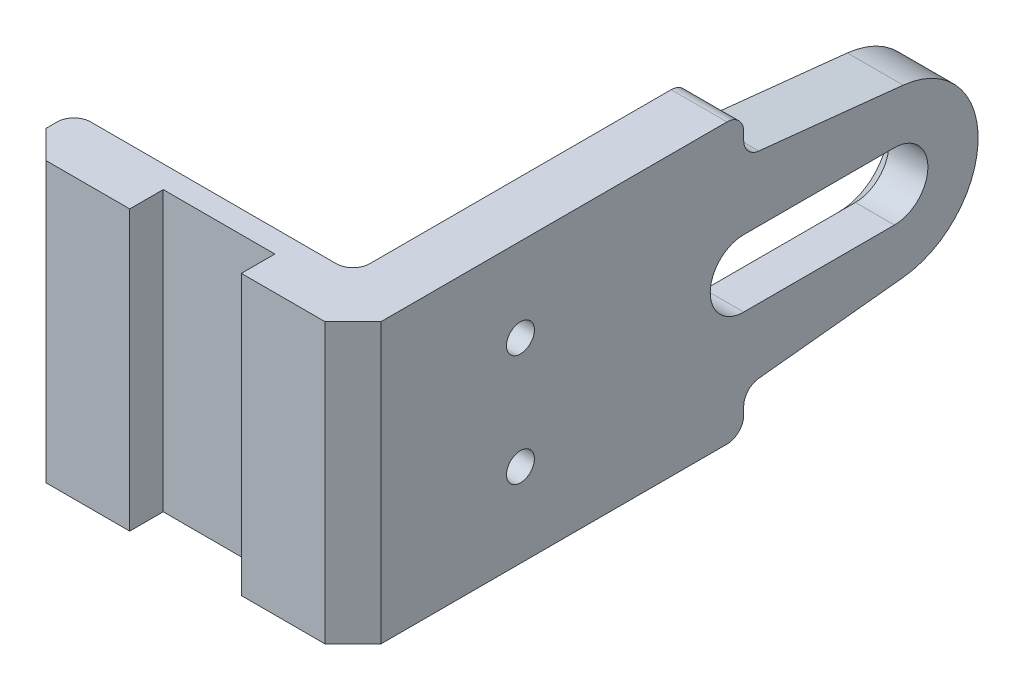
ISO-10303-21;
HEADER;
FILE_DESCRIPTION(('STEP AP214'),'2;1');
FILE_NAME('part.step','',(''),(''),'','','');
FILE_SCHEMA(('AUTOMOTIVE_DESIGN { 1 0 10303 214 1 1 1 1 }'));
ENDSEC;
DATA;
#1=APPLICATION_CONTEXT('core data for automotive mechanical design processes');
#2=APPLICATION_PROTOCOL_DEFINITION('international standard','automotive_design',2000,#1);
#3=PRODUCT_CONTEXT('',#1,'mechanical');
#4=PRODUCT('Part','Part','',(#3));
#5=PRODUCT_RELATED_PRODUCT_CATEGORY('part','',(#4));
#6=PRODUCT_DEFINITION_FORMATION('','',#4);
#7=PRODUCT_DEFINITION_CONTEXT('part definition',#1,'design');
#8=PRODUCT_DEFINITION('design','',#6,#7);
#9=PRODUCT_DEFINITION_SHAPE('','',#8);
#10=(LENGTH_UNIT() NAMED_UNIT(*) SI_UNIT(.MILLI.,.METRE.));
#11=(NAMED_UNIT(*) PLANE_ANGLE_UNIT() SI_UNIT($,.RADIAN.));
#12=(NAMED_UNIT(*) SI_UNIT($,.STERADIAN.) SOLID_ANGLE_UNIT());
#13=UNCERTAINTY_MEASURE_WITH_UNIT(LENGTH_MEASURE(1.E-05),#10,'distance_accuracy_value','');
#14=(GEOMETRIC_REPRESENTATION_CONTEXT(3) GLOBAL_UNCERTAINTY_ASSIGNED_CONTEXT((#13)) GLOBAL_UNIT_ASSIGNED_CONTEXT((#10,
#11,#12)) REPRESENTATION_CONTEXT('',''));
#15=CARTESIAN_POINT('',(0.,0.,0.));
#16=DIRECTION('',(0.,0.,1.));
#17=DIRECTION('',(1.,0.,0.));
#18=AXIS2_PLACEMENT_3D('',#15,#16,#17);
#19=CARTESIAN_POINT('',(0.,25.,0.));
#20=DIRECTION('',(0.,0.,1.));
#21=DIRECTION('',(1.,0.,0.));
#22=AXIS2_PLACEMENT_3D('',#19,#20,#21);
#23=PLANE('',#22);
#24=DIRECTION('',(-1.,0.,0.));
#25=VECTOR('',#24,1.);
#26=CARTESIAN_POINT('',(0.,0.,0.));
#27=LINE('',#26,#25);
#28=CARTESIAN_POINT('',(-2.50000000000002,0.,0.));
#29=VERTEX_POINT('',#28);
#30=CARTESIAN_POINT('',(-10.,0.,0.));
#31=VERTEX_POINT('',#30);
#32=EDGE_CURVE('E247',#29,#31,#27,.T.);
#33=ORIENTED_EDGE('',*,*,#32,.F.);
#34=DIRECTION('',(0.,1.,0.));
#35=VECTOR('',#34,1.);
#36=CARTESIAN_POINT('',(-2.50000000000002,25.,0.));
#37=LINE('',#36,#35);
#38=CARTESIAN_POINT('',(-2.50000000000002,25.,0.));
#39=VERTEX_POINT('',#38);
#40=EDGE_CURVE('E407',#29,#39,#37,.T.);
#41=ORIENTED_EDGE('',*,*,#40,.T.);
#42=DIRECTION('',(-1.,0.,0.));
#43=VECTOR('',#42,1.);
#44=CARTESIAN_POINT('',(0.,25.,0.));
#45=LINE('',#44,#43);
#46=CARTESIAN_POINT('',(-10.,25.,0.));
#47=VERTEX_POINT('',#46);
#48=EDGE_CURVE('E330',#39,#47,#45,.T.);
#49=ORIENTED_EDGE('',*,*,#48,.T.);
#50=DIRECTION('',(0.,1.,0.));
#51=VECTOR('',#50,1.);
#52=CARTESIAN_POINT('',(-10.,0.,0.));
#53=LINE('',#52,#51);
#54=EDGE_CURVE('E242',#31,#47,#53,.T.);
#55=ORIENTED_EDGE('',*,*,#54,.F.);
#56=EDGE_LOOP('',(#33,#41,#49,#55));
#57=FACE_BOUND('',#56,.T.);
#58=ADVANCED_FACE('F35',(#57),#23,.T.);
#59=CARTESIAN_POINT('',(0.,25.,0.));
#60=DIRECTION('',(0.,-1.,0.));
#61=DIRECTION('',(0.,0.,-1.));
#62=AXIS2_PLACEMENT_3D('',#59,#60,#61);
#63=PLANE('',#62);
#64=DIRECTION('',(-1.,0.,0.));
#65=VECTOR('',#64,1.);
#66=CARTESIAN_POINT('',(-5.,25.,-5.));
#67=LINE('',#66,#65);
#68=CARTESIAN_POINT('',(-6.5,25.,-5.));
#69=VERTEX_POINT('',#68);
#70=CARTESIAN_POINT('',(-28.5,25.,-5.));
#71=VERTEX_POINT('',#70);
#72=EDGE_CURVE('E336',#69,#71,#67,.T.);
#73=ORIENTED_EDGE('',*,*,#72,.T.);
#74=CARTESIAN_POINT('',(-28.5,25.,-3.5));
#75=DIRECTION('',(0.,-1.,0.));
#76=DIRECTION('',(0.,0.,-1.));
#77=AXIS2_PLACEMENT_3D('',#74,#75,#76);
#78=CIRCLE('',#77,1.5);
#79=CARTESIAN_POINT('',(-30.,25.,-3.5));
#80=VERTEX_POINT('',#79);
#81=EDGE_CURVE('E428',#71,#80,#78,.F.);
#82=ORIENTED_EDGE('',*,*,#81,.T.);
#83=DIRECTION('',(0.,0.,-1.));
#84=VECTOR('',#83,1.);
#85=CARTESIAN_POINT('',(-30.,25.,0.));
#86=LINE('',#85,#84);
#87=CARTESIAN_POINT('',(-30.,25.,-2.50000000000001));
#88=VERTEX_POINT('',#87);
#89=EDGE_CURVE('E332',#88,#80,#86,.T.);
#90=ORIENTED_EDGE('',*,*,#89,.F.);
#91=DIRECTION('',(-0.707106781186546,0.,-0.707106781186549));
#92=VECTOR('',#91,1.);
#93=CARTESIAN_POINT('',(-27.5,25.,0.));
#94=LINE('',#93,#92);
#95=CARTESIAN_POINT('',(-27.5,25.,0.));
#96=VERTEX_POINT('',#95);
#97=EDGE_CURVE('E409',#88,#96,#94,.F.);
#98=ORIENTED_EDGE('',*,*,#97,.T.);
#99=CARTESIAN_POINT('',(-20.,25.,0.));
#100=VERTEX_POINT('',#99);
#101=EDGE_CURVE('E333',#100,#96,#45,.T.);
#102=ORIENTED_EDGE('',*,*,#101,.F.);
#103=DIRECTION('',(0.,0.,1.));
#104=VECTOR('',#103,1.);
#105=CARTESIAN_POINT('',(-20.,25.,-3.));
#106=LINE('',#105,#104);
#107=CARTESIAN_POINT('',(-20.,25.,-3.));
#108=VERTEX_POINT('',#107);
#109=EDGE_CURVE('E232',#108,#100,#106,.T.);
#110=ORIENTED_EDGE('',*,*,#109,.F.);
#111=DIRECTION('',(1.,0.,0.));
#112=VECTOR('',#111,1.);
#113=CARTESIAN_POINT('',(-20.,25.,-3.));
#114=LINE('',#113,#112);
#115=CARTESIAN_POINT('',(-10.,25.,-3.));
#116=VERTEX_POINT('',#115);
#117=EDGE_CURVE('E252',#108,#116,#114,.T.);
#118=ORIENTED_EDGE('',*,*,#117,.T.);
#119=DIRECTION('',(0.,0.,1.));
#120=VECTOR('',#119,1.);
#121=CARTESIAN_POINT('',(-10.,25.,-3.));
#122=LINE('',#121,#120);
#123=EDGE_CURVE('E240',#116,#47,#122,.T.);
#124=ORIENTED_EDGE('',*,*,#123,.T.);
#125=ORIENTED_EDGE('',*,*,#48,.F.);
#126=DIRECTION('',(0.707106781186549,0.,-0.707106781186546));
#127=VECTOR('',#126,1.);
#128=CARTESIAN_POINT('',(0.,25.,-2.50000000000001));
#129=LINE('',#128,#127);
#130=CARTESIAN_POINT('',(0.,25.,-2.50000000000001));
#131=VERTEX_POINT('',#130);
#132=EDGE_CURVE('E411',#39,#131,#129,.T.);
#133=ORIENTED_EDGE('',*,*,#132,.T.);
#134=DIRECTION('',(0.,0.,-1.));
#135=VECTOR('',#134,1.);
#136=CARTESIAN_POINT('',(0.,25.,0.));
#137=LINE('',#136,#135);
#138=CARTESIAN_POINT('',(0.,25.,-33.5));
#139=VERTEX_POINT('',#138);
#140=EDGE_CURVE('E341',#131,#139,#137,.T.);
#141=ORIENTED_EDGE('',*,*,#140,.T.);
#142=DIRECTION('',(-1.,0.,0.));
#143=VECTOR('',#142,1.);
#144=CARTESIAN_POINT('',(0.,25.,-33.5));
#145=LINE('',#144,#143);
#146=CARTESIAN_POINT('',(-5.,25.,-33.5));
#147=VERTEX_POINT('',#146);
#148=EDGE_CURVE('E389',#139,#147,#145,.T.);
#149=ORIENTED_EDGE('',*,*,#148,.T.);
#150=DIRECTION('',(0.,0.,-1.));
#151=VECTOR('',#150,1.);
#152=CARTESIAN_POINT('',(-5.,25.,-5.));
#153=LINE('',#152,#151);
#154=CARTESIAN_POINT('',(-5.,25.,-6.5));
#155=VERTEX_POINT('',#154);
#156=EDGE_CURVE('E339',#155,#147,#153,.T.);
#157=ORIENTED_EDGE('',*,*,#156,.F.);
#158=CARTESIAN_POINT('',(-6.5,25.,-6.5));
#159=DIRECTION('',(0.,-1.,0.));
#160=DIRECTION('',(0.,0.,-1.));
#161=AXIS2_PLACEMENT_3D('',#158,#159,#160);
#162=CIRCLE('',#161,1.5);
#163=EDGE_CURVE('E434',#155,#69,#162,.T.);
#164=ORIENTED_EDGE('',*,*,#163,.T.);
#165=EDGE_LOOP('',(#73,#82,#90,#98,#102,#110,#118,#124,#125,#133,#141,#149,#157,#164));
#166=FACE_BOUND('',#165,.T.);
#167=ADVANCED_FACE('F502',(#166),#63,.F.);
#168=CARTESIAN_POINT('',(0.,0.,0.));
#169=DIRECTION('',(0.,-1.,0.));
#170=DIRECTION('',(0.,0.,-1.));
#171=AXIS2_PLACEMENT_3D('',#168,#169,#170);
#172=PLANE('',#171);
#173=DIRECTION('',(0.,0.,-1.));
#174=VECTOR('',#173,1.);
#175=CARTESIAN_POINT('',(-30.,0.,0.));
#176=LINE('',#175,#174);
#177=CARTESIAN_POINT('',(-30.,0.,-2.50000000000001));
#178=VERTEX_POINT('',#177);
#179=CARTESIAN_POINT('',(-30.,0.,-3.5));
#180=VERTEX_POINT('',#179);
#181=EDGE_CURVE('E345',#178,#180,#176,.T.);
#182=ORIENTED_EDGE('',*,*,#181,.T.);
#183=CARTESIAN_POINT('',(-28.5,0.,-3.5));
#184=DIRECTION('',(0.,-1.,0.));
#185=DIRECTION('',(0.,0.,-1.));
#186=AXIS2_PLACEMENT_3D('',#183,#184,#185);
#187=CIRCLE('',#186,1.5);
#188=CARTESIAN_POINT('',(-28.5,0.,-5.));
#189=VERTEX_POINT('',#188);
#190=EDGE_CURVE('E421',#180,#189,#187,.T.);
#191=ORIENTED_EDGE('',*,*,#190,.T.);
#192=DIRECTION('',(-1.,0.,0.));
#193=VECTOR('',#192,1.);
#194=CARTESIAN_POINT('',(-5.,0.,-5.));
#195=LINE('',#194,#193);
#196=CARTESIAN_POINT('',(-6.5,0.,-5.));
#197=VERTEX_POINT('',#196);
#198=EDGE_CURVE('E347',#197,#189,#195,.T.);
#199=ORIENTED_EDGE('',*,*,#198,.F.);
#200=CARTESIAN_POINT('',(-6.5,0.,-6.5));
#201=DIRECTION('',(0.,-1.,0.));
#202=DIRECTION('',(0.,0.,-1.));
#203=AXIS2_PLACEMENT_3D('',#200,#201,#202);
#204=CIRCLE('',#203,1.5);
#205=CARTESIAN_POINT('',(-5.,0.,-6.5));
#206=VERTEX_POINT('',#205);
#207=EDGE_CURVE('E432',#197,#206,#204,.F.);
#208=ORIENTED_EDGE('',*,*,#207,.T.);
#209=DIRECTION('',(0.,0.,-1.));
#210=VECTOR('',#209,1.);
#211=CARTESIAN_POINT('',(-5.,0.,-5.));
#212=LINE('',#211,#210);
#213=CARTESIAN_POINT('',(-5.,0.,-33.5));
#214=VERTEX_POINT('',#213);
#215=EDGE_CURVE('E350',#206,#214,#212,.T.);
#216=ORIENTED_EDGE('',*,*,#215,.T.);
#217=DIRECTION('',(-1.,0.,0.));
#218=VECTOR('',#217,1.);
#219=CARTESIAN_POINT('',(0.,0.,-33.5));
#220=LINE('',#219,#218);
#221=CARTESIAN_POINT('',(0.,0.,-33.5));
#222=VERTEX_POINT('',#221);
#223=EDGE_CURVE('E381',#214,#222,#220,.F.);
#224=ORIENTED_EDGE('',*,*,#223,.T.);
#225=DIRECTION('',(0.,0.,-1.));
#226=VECTOR('',#225,1.);
#227=CARTESIAN_POINT('',(0.,0.,0.));
#228=LINE('',#227,#226);
#229=CARTESIAN_POINT('',(0.,0.,-2.50000000000001));
#230=VERTEX_POINT('',#229);
#231=EDGE_CURVE('E352',#230,#222,#228,.T.);
#232=ORIENTED_EDGE('',*,*,#231,.F.);
#233=DIRECTION('',(-0.707106781186549,0.,0.707106781186546));
#234=VECTOR('',#233,1.);
#235=CARTESIAN_POINT('',(-1.25,0.,-1.25000000000001));
#236=LINE('',#235,#234);
#237=EDGE_CURVE('E405',#230,#29,#236,.T.);
#238=ORIENTED_EDGE('',*,*,#237,.T.);
#239=ORIENTED_EDGE('',*,*,#32,.T.);
#240=DIRECTION('',(0.,0.,1.));
#241=VECTOR('',#240,1.);
#242=CARTESIAN_POINT('',(-10.,0.,-3.));
#243=LINE('',#242,#241);
#244=CARTESIAN_POINT('',(-10.,0.,-3.));
#245=VERTEX_POINT('',#244);
#246=EDGE_CURVE('E231',#245,#31,#243,.T.);
#247=ORIENTED_EDGE('',*,*,#246,.F.);
#248=DIRECTION('',(1.,0.,0.));
#249=VECTOR('',#248,1.);
#250=CARTESIAN_POINT('',(-20.,0.,-3.));
#251=LINE('',#250,#249);
#252=CARTESIAN_POINT('',(-20.,0.,-3.));
#253=VERTEX_POINT('',#252);
#254=EDGE_CURVE('E220',#253,#245,#251,.T.);
#255=ORIENTED_EDGE('',*,*,#254,.F.);
#256=DIRECTION('',(0.,0.,1.));
#257=VECTOR('',#256,1.);
#258=CARTESIAN_POINT('',(-20.,0.,-3.));
#259=LINE('',#258,#257);
#260=CARTESIAN_POINT('',(-20.,0.,0.));
#261=VERTEX_POINT('',#260);
#262=EDGE_CURVE('E248',#253,#261,#259,.T.);
#263=ORIENTED_EDGE('',*,*,#262,.T.);
#264=CARTESIAN_POINT('',(-27.5,0.,0.));
#265=VERTEX_POINT('',#264);
#266=EDGE_CURVE('E329',#261,#265,#27,.T.);
#267=ORIENTED_EDGE('',*,*,#266,.T.);
#268=DIRECTION('',(0.707106781186546,0.,0.707106781186549));
#269=VECTOR('',#268,1.);
#270=CARTESIAN_POINT('',(-13.7500000000001,0.,13.75));
#271=LINE('',#270,#269);
#272=EDGE_CURVE('E403',#265,#178,#271,.F.);
#273=ORIENTED_EDGE('',*,*,#272,.T.);
#274=EDGE_LOOP('',(#182,#191,#199,#208,#216,#224,#232,#238,#239,#247,#255,#263,#267,#273));
#275=FACE_BOUND('',#274,.T.);
#276=ADVANCED_FACE('F245',(#275),#172,.T.);
#277=CARTESIAN_POINT('',(0.,25.,0.));
#278=DIRECTION('',(-1.,0.,0.));
#279=DIRECTION('',(0.,0.,1.));
#280=AXIS2_PLACEMENT_3D('',#277,#278,#279);
#281=PLANE('',#280);
#282=CARTESIAN_POINT('',(0.,17.5,-15.));
#283=DIRECTION('',(1.,0.,0.));
#284=DIRECTION('',(0.,0.,-1.));
#285=AXIS2_PLACEMENT_3D('',#282,#283,#284);
#286=CIRCLE('',#285,1.25);
#287=CARTESIAN_POINT('',(0.,17.5,-16.25));
#288=VERTEX_POINT('',#287);
#289=EDGE_CURVE('E279',#288,#288,#286,.T.);
#290=ORIENTED_EDGE('',*,*,#289,.F.);
#291=EDGE_LOOP('',(#290));
#292=FACE_BOUND('',#291,.T.);
#293=CARTESIAN_POINT('',(0.,7.5,-15.));
#294=DIRECTION('',(1.,0.,0.));
#295=DIRECTION('',(0.,0.,-1.));
#296=AXIS2_PLACEMENT_3D('',#293,#294,#295);
#297=CIRCLE('',#296,1.25);
#298=CARTESIAN_POINT('',(0.,7.5,-16.25));
#299=VERTEX_POINT('',#298);
#300=EDGE_CURVE('E269',#299,#299,#297,.T.);
#301=ORIENTED_EDGE('',*,*,#300,.F.);
#302=EDGE_LOOP('',(#301));
#303=FACE_BOUND('',#302,.T.);
#304=DIRECTION('',(0.,0.,-1.));
#305=VECTOR('',#304,1.);
#306=CARTESIAN_POINT('',(0.,9.5,-35.));
#307=LINE('',#306,#305);
#308=CARTESIAN_POINT('',(0.,9.5,-35.));
#309=VERTEX_POINT('',#308);
#310=CARTESIAN_POINT('',(0.,9.5,-48.5));
#311=VERTEX_POINT('',#310);
#312=EDGE_CURVE('E287',#309,#311,#307,.T.);
#313=ORIENTED_EDGE('',*,*,#312,.F.);
#314=CARTESIAN_POINT('',(0.,12.5,-35.));
#315=DIRECTION('',(1.,0.,0.));
#316=DIRECTION('',(0.,0.,-1.));
#317=AXIS2_PLACEMENT_3D('',#314,#315,#316);
#318=CIRCLE('',#317,3.);
#319=CARTESIAN_POINT('',(0.,15.5,-35.));
#320=VERTEX_POINT('',#319);
#321=EDGE_CURVE('E282',#320,#309,#318,.T.);
#322=ORIENTED_EDGE('',*,*,#321,.F.);
#323=DIRECTION('',(0.,0.,-1.));
#324=VECTOR('',#323,1.);
#325=CARTESIAN_POINT('',(0.,15.5,-35.));
#326=LINE('',#325,#324);
#327=CARTESIAN_POINT('',(0.,15.5,-48.5));
#328=VERTEX_POINT('',#327);
#329=EDGE_CURVE('E293',#320,#328,#326,.T.);
#330=ORIENTED_EDGE('',*,*,#329,.T.);
#331=CARTESIAN_POINT('',(0.,12.5,-48.5));
#332=DIRECTION('',(1.,0.,0.));
#333=DIRECTION('',(0.,0.,-1.));
#334=AXIS2_PLACEMENT_3D('',#331,#332,#333);
#335=CIRCLE('',#334,3.);
#336=EDGE_CURVE('E290',#311,#328,#335,.T.);
#337=ORIENTED_EDGE('',*,*,#336,.F.);
#338=EDGE_LOOP('',(#313,#322,#330,#337));
#339=FACE_BOUND('',#338,.T.);
#340=ORIENTED_EDGE('',*,*,#140,.F.);
#341=DIRECTION('',(0.,-1.,0.));
#342=VECTOR('',#341,1.);
#343=CARTESIAN_POINT('',(0.,0.,-2.50000000000001));
#344=LINE('',#343,#342);
#345=EDGE_CURVE('E400',#131,#230,#344,.T.);
#346=ORIENTED_EDGE('',*,*,#345,.T.);
#347=ORIENTED_EDGE('',*,*,#231,.T.);
#348=CARTESIAN_POINT('',(0.,1.5,-33.5));
#349=DIRECTION('',(-1.,0.,0.));
#350=DIRECTION('',(0.,0.,1.));
#351=AXIS2_PLACEMENT_3D('',#348,#349,#350);
#352=CIRCLE('',#351,1.5);
#353=CARTESIAN_POINT('',(0.,1.5,-35.));
#354=VERTEX_POINT('',#353);
#355=EDGE_CURVE('E387',#222,#354,#352,.F.);
#356=ORIENTED_EDGE('',*,*,#355,.T.);
#357=DIRECTION('',(0.,-1.,0.));
#358=VECTOR('',#357,1.);
#359=CARTESIAN_POINT('',(0.,0.,-35.));
#360=LINE('',#359,#358);
#361=CARTESIAN_POINT('',(0.,2.18917466074018,-35.));
#362=VERTEX_POINT('',#361);
#363=EDGE_CURVE('E306',#362,#354,#360,.T.);
#364=ORIENTED_EDGE('',*,*,#363,.F.);
#365=CARTESIAN_POINT('',(0.,2.18917466074018,-36.5));
#366=DIRECTION('',(-1.,0.,0.));
#367=DIRECTION('',(0.,0.,1.));
#368=AXIS2_PLACEMENT_3D('',#365,#366,#367);
#369=CIRCLE('',#368,1.5);
#370=CARTESIAN_POINT('',(0.,3.68095750379259,-36.3432073050985));
#371=VERTEX_POINT('',#370);
#372=EDGE_CURVE('E396',#362,#371,#369,.T.);
#373=ORIENTED_EDGE('',*,*,#372,.T.);
#374=DIRECTION('',(0.,0.104528463267658,-0.994521895368273));
#375=VECTOR('',#374,1.);
#376=CARTESIAN_POINT('',(0.,-0.137350213006646,-0.014436089101642));
#377=LINE('',#376,#375);
#378=CARTESIAN_POINT('',(0.,5.04108578473796,-49.2839634745074));
#379=VERTEX_POINT('',#378);
#380=EDGE_CURVE('E299',#371,#379,#377,.T.);
#381=ORIENTED_EDGE('',*,*,#380,.T.);
#382=CARTESIAN_POINT('',(0.,12.5,-48.5));
#383=DIRECTION('',(1.,0.,0.));
#384=DIRECTION('',(0.,0.,-1.));
#385=AXIS2_PLACEMENT_3D('',#382,#383,#384);
#386=CIRCLE('',#385,7.5);
#387=CARTESIAN_POINT('',(0.,19.9589142152621,-49.2839634745074));
#388=VERTEX_POINT('',#387);
#389=EDGE_CURVE('E320',#379,#388,#386,.T.);
#390=ORIENTED_EDGE('',*,*,#389,.T.);
#391=DIRECTION('',(0.,-0.10452846326765,-0.994521895368274));
#392=VECTOR('',#391,1.);
#393=CARTESIAN_POINT('',(0.,24.8641952221789,-2.61333222432352));
#394=LINE('',#393,#392);
#395=CARTESIAN_POINT('',(0.,21.3190424962073,-36.3432073050985));
#396=VERTEX_POINT('',#395);
#397=EDGE_CURVE('E318',#396,#388,#394,.T.);
#398=ORIENTED_EDGE('',*,*,#397,.F.);
#399=CARTESIAN_POINT('',(0.,22.8108253392597,-36.5));
#400=DIRECTION('',(-1.,0.,0.));
#401=DIRECTION('',(0.,0.,1.));
#402=AXIS2_PLACEMENT_3D('',#399,#400,#401);
#403=CIRCLE('',#402,1.5);
#404=CARTESIAN_POINT('',(0.,22.8108253392597,-35.));
#405=VERTEX_POINT('',#404);
#406=EDGE_CURVE('E392',#396,#405,#403,.T.);
#407=ORIENTED_EDGE('',*,*,#406,.T.);
#408=DIRECTION('',(0.,-1.,0.));
#409=VECTOR('',#408,1.);
#410=CARTESIAN_POINT('',(0.,0.,-35.));
#411=LINE('',#410,#409);
#412=CARTESIAN_POINT('',(0.,23.5,-35.));
#413=VERTEX_POINT('',#412);
#414=EDGE_CURVE('E315',#413,#405,#411,.T.);
#415=ORIENTED_EDGE('',*,*,#414,.F.);
#416=CARTESIAN_POINT('',(0.,23.5,-33.5));
#417=DIRECTION('',(-1.,0.,0.));
#418=DIRECTION('',(0.,0.,1.));
#419=AXIS2_PLACEMENT_3D('',#416,#417,#418);
#420=CIRCLE('',#419,1.5);
#421=EDGE_CURVE('E384',#413,#139,#420,.F.);
#422=ORIENTED_EDGE('',*,*,#421,.T.);
#423=EDGE_LOOP('',(#340,#346,#347,#356,#364,#373,#381,#390,#398,#407,#415,#422));
#424=FACE_BOUND('',#423,.T.);
#425=ADVANCED_FACE('F486',(#292,#303,#339,#424),#281,.F.);
#426=CARTESIAN_POINT('',(-5.,25.,-5.));
#427=DIRECTION('',(-1.,0.,0.));
#428=DIRECTION('',(0.,0.,1.));
#429=AXIS2_PLACEMENT_3D('',#426,#427,#428);
#430=PLANE('',#429);
#431=CARTESIAN_POINT('',(-5.,12.5,-35.));
#432=DIRECTION('',(-1.,0.,0.));
#433=DIRECTION('',(0.,0.,1.));
#434=AXIS2_PLACEMENT_3D('',#431,#432,#433);
#435=CIRCLE('',#434,4.5);
#436=CARTESIAN_POINT('',(-5.,17.,-35.));
#437=VERTEX_POINT('',#436);
#438=CARTESIAN_POINT('',(-5.,8.,-35.));
#439=VERTEX_POINT('',#438);
#440=EDGE_CURVE('E441',#437,#439,#435,.F.);
#441=ORIENTED_EDGE('',*,*,#440,.T.);
#442=DIRECTION('',(0.,0.,-1.));
#443=VECTOR('',#442,1.);
#444=CARTESIAN_POINT('',(-5.,8.,-48.5));
#445=LINE('',#444,#443);
#446=CARTESIAN_POINT('',(-5.,8.,-48.5));
#447=VERTEX_POINT('',#446);
#448=EDGE_CURVE('E445',#439,#447,#445,.T.);
#449=ORIENTED_EDGE('',*,*,#448,.T.);
#450=CARTESIAN_POINT('',(-5.,12.5,-48.5));
#451=DIRECTION('',(-1.,0.,0.));
#452=DIRECTION('',(0.,0.,1.));
#453=AXIS2_PLACEMENT_3D('',#450,#451,#452);
#454=CIRCLE('',#453,4.5);
#455=CARTESIAN_POINT('',(-5.,17.,-48.5));
#456=VERTEX_POINT('',#455);
#457=EDGE_CURVE('E443',#447,#456,#454,.F.);
#458=ORIENTED_EDGE('',*,*,#457,.T.);
#459=DIRECTION('',(0.,0.,1.));
#460=VECTOR('',#459,1.);
#461=CARTESIAN_POINT('',(-5.,17.,-5.));
#462=LINE('',#461,#460);
#463=EDGE_CURVE('E439',#456,#437,#462,.T.);
#464=ORIENTED_EDGE('',*,*,#463,.T.);
#465=EDGE_LOOP('',(#441,#449,#458,#464));
#466=FACE_BOUND('',#465,.T.);
#467=CARTESIAN_POINT('',(-5.,17.5,-15.));
#468=DIRECTION('',(1.,0.,0.));
#469=DIRECTION('',(0.,0.,-1.));
#470=AXIS2_PLACEMENT_3D('',#467,#468,#469);
#471=CIRCLE('',#470,3.);
#472=CARTESIAN_POINT('',(-5.,17.5,-18.));
#473=VERTEX_POINT('',#472);
#474=EDGE_CURVE('E266',#473,#473,#471,.T.);
#475=ORIENTED_EDGE('',*,*,#474,.T.);
#476=EDGE_LOOP('',(#475));
#477=FACE_BOUND('',#476,.T.);
#478=CARTESIAN_POINT('',(-5.,7.5,-15.));
#479=DIRECTION('',(1.,0.,0.));
#480=DIRECTION('',(0.,0.,-1.));
#481=AXIS2_PLACEMENT_3D('',#478,#479,#480);
#482=CIRCLE('',#481,3.);
#483=CARTESIAN_POINT('',(-5.,7.5,-18.));
#484=VERTEX_POINT('',#483);
#485=EDGE_CURVE('E265',#484,#484,#482,.T.);
#486=ORIENTED_EDGE('',*,*,#485,.T.);
#487=EDGE_LOOP('',(#486));
#488=FACE_BOUND('',#487,.T.);
#489=ORIENTED_EDGE('',*,*,#215,.F.);
#490=DIRECTION('',(0.,-1.,0.));
#491=VECTOR('',#490,1.);
#492=CARTESIAN_POINT('',(-5.,25.,-6.5));
#493=LINE('',#492,#491);
#494=EDGE_CURVE('E430',#206,#155,#493,.F.);
#495=ORIENTED_EDGE('',*,*,#494,.T.);
#496=ORIENTED_EDGE('',*,*,#156,.T.);
#497=CARTESIAN_POINT('',(-5.,23.5,-33.5));
#498=DIRECTION('',(-1.,0.,0.));
#499=DIRECTION('',(0.,0.,1.));
#500=AXIS2_PLACEMENT_3D('',#497,#498,#499);
#501=CIRCLE('',#500,1.5);
#502=CARTESIAN_POINT('',(-5.,23.5,-35.));
#503=VERTEX_POINT('',#502);
#504=EDGE_CURVE('E376',#147,#503,#501,.T.);
#505=ORIENTED_EDGE('',*,*,#504,.T.);
#506=DIRECTION('',(0.,1.,0.));
#507=VECTOR('',#506,1.);
#508=CARTESIAN_POINT('',(-5.,25.,-35.));
#509=LINE('',#508,#507);
#510=CARTESIAN_POINT('',(-5.,22.8108253392597,-35.));
#511=VERTEX_POINT('',#510);
#512=EDGE_CURVE('E326',#511,#503,#509,.T.);
#513=ORIENTED_EDGE('',*,*,#512,.F.);
#514=CARTESIAN_POINT('',(-5.,22.8108253392597,-36.5));
#515=DIRECTION('',(-1.,0.,0.));
#516=DIRECTION('',(0.,0.,1.));
#517=AXIS2_PLACEMENT_3D('',#514,#515,#516);
#518=CIRCLE('',#517,1.5);
#519=CARTESIAN_POINT('',(-5.,21.3190424962073,-36.3432073050985));
#520=VERTEX_POINT('',#519);
#521=EDGE_CURVE('E394',#511,#520,#518,.F.);
#522=ORIENTED_EDGE('',*,*,#521,.T.);
#523=DIRECTION('',(0.,0.10452846326765,0.994521895368274));
#524=VECTOR('',#523,1.);
#525=CARTESIAN_POINT('',(-5.,24.6175709859619,-4.95980509093612));
#526=LINE('',#525,#524);
#527=CARTESIAN_POINT('',(-5.,19.9589142152621,-49.2839634745074));
#528=VERTEX_POINT('',#527);
#529=EDGE_CURVE('E343',#528,#520,#526,.T.);
#530=ORIENTED_EDGE('',*,*,#529,.F.);
#531=CARTESIAN_POINT('',(-5.,12.5,-48.5));
#532=DIRECTION('',(-1.,0.,0.));
#533=DIRECTION('',(0.,0.,1.));
#534=AXIS2_PLACEMENT_3D('',#531,#532,#533);
#535=CIRCLE('',#534,7.5);
#536=CARTESIAN_POINT('',(-5.,5.04108578473796,-49.2839634745074));
#537=VERTEX_POINT('',#536);
#538=EDGE_CURVE('E356',#528,#537,#535,.T.);
#539=ORIENTED_EDGE('',*,*,#538,.T.);
#540=DIRECTION('',(0.,-0.104528463267658,0.994521895368273));
#541=VECTOR('',#540,1.);
#542=CARTESIAN_POINT('',(-5.,0.655584004865227,-7.55870122615825));
#543=LINE('',#542,#541);
#544=CARTESIAN_POINT('',(-5.,3.68095750379259,-36.3432073050985));
#545=VERTEX_POINT('',#544);
#546=EDGE_CURVE('E358',#537,#545,#543,.T.);
#547=ORIENTED_EDGE('',*,*,#546,.T.);
#548=CARTESIAN_POINT('',(-5.,2.18917466074018,-36.5));
#549=DIRECTION('',(-1.,0.,0.));
#550=DIRECTION('',(0.,0.,1.));
#551=AXIS2_PLACEMENT_3D('',#548,#549,#550);
#552=CIRCLE('',#551,1.5);
#553=CARTESIAN_POINT('',(-5.,2.18917466074018,-35.));
#554=VERTEX_POINT('',#553);
#555=EDGE_CURVE('E398',#545,#554,#552,.F.);
#556=ORIENTED_EDGE('',*,*,#555,.T.);
#557=DIRECTION('',(0.,1.,0.));
#558=VECTOR('',#557,1.);
#559=CARTESIAN_POINT('',(-5.,25.,-35.));
#560=LINE('',#559,#558);
#561=CARTESIAN_POINT('',(-5.,1.5,-35.));
#562=VERTEX_POINT('',#561);
#563=EDGE_CURVE('E312',#562,#554,#560,.T.);
#564=ORIENTED_EDGE('',*,*,#563,.F.);
#565=CARTESIAN_POINT('',(-5.,1.5,-33.5));
#566=DIRECTION('',(-1.,0.,0.));
#567=DIRECTION('',(0.,0.,1.));
#568=AXIS2_PLACEMENT_3D('',#565,#566,#567);
#569=CIRCLE('',#568,1.5);
#570=EDGE_CURVE('E378',#562,#214,#569,.T.);
#571=ORIENTED_EDGE('',*,*,#570,.T.);
#572=EDGE_LOOP('',(#489,#495,#496,#505,#513,#522,#530,#539,#547,#556,#564,#571));
#573=FACE_BOUND('',#572,.T.);
#574=ADVANCED_FACE('F469',(#466,#477,#488,#573),#430,.T.);
#575=ORIENTED_EDGE('',*,*,#101,.T.);
#576=DIRECTION('',(0.,-1.,0.));
#577=VECTOR('',#576,1.);
#578=CARTESIAN_POINT('',(-27.5,25.,0.));
#579=LINE('',#578,#577);
#580=EDGE_CURVE('E413',#96,#265,#579,.T.);
#581=ORIENTED_EDGE('',*,*,#580,.T.);
#582=ORIENTED_EDGE('',*,*,#266,.F.);
#583=DIRECTION('',(0.,1.,0.));
#584=VECTOR('',#583,1.);
#585=CARTESIAN_POINT('',(-20.,0.,0.));
#586=LINE('',#585,#584);
#587=EDGE_CURVE('E257',#261,#100,#586,.T.);
#588=ORIENTED_EDGE('',*,*,#587,.T.);
#589=EDGE_LOOP('',(#575,#581,#582,#588));
#590=FACE_BOUND('',#589,.T.);
#591=ADVANCED_FACE('F505',(#590),#23,.T.);
#592=CARTESIAN_POINT('',(-5.,25.,-5.));
#593=DIRECTION('',(0.,0.,1.));
#594=DIRECTION('',(1.,0.,0.));
#595=AXIS2_PLACEMENT_3D('',#592,#593,#594);
#596=PLANE('',#595);
#597=ORIENTED_EDGE('',*,*,#198,.T.);
#598=DIRECTION('',(0.,-1.,0.));
#599=VECTOR('',#598,1.);
#600=CARTESIAN_POINT('',(-28.5,25.,-5.));
#601=LINE('',#600,#599);
#602=EDGE_CURVE('E426',#189,#71,#601,.F.);
#603=ORIENTED_EDGE('',*,*,#602,.T.);
#604=ORIENTED_EDGE('',*,*,#72,.F.);
#605=DIRECTION('',(0.,-1.,0.));
#606=VECTOR('',#605,1.);
#607=CARTESIAN_POINT('',(-6.5,25.,-5.));
#608=LINE('',#607,#606);
#609=EDGE_CURVE('E423',#69,#197,#608,.T.);
#610=ORIENTED_EDGE('',*,*,#609,.T.);
#611=EDGE_LOOP('',(#597,#603,#604,#610));
#612=FACE_BOUND('',#611,.T.);
#613=ADVANCED_FACE('F514',(#612),#596,.F.);
#614=CARTESIAN_POINT('',(-30.,25.,0.));
#615=DIRECTION('',(-1.,0.,0.));
#616=DIRECTION('',(0.,0.,1.));
#617=AXIS2_PLACEMENT_3D('',#614,#615,#616);
#618=PLANE('',#617);
#619=ORIENTED_EDGE('',*,*,#89,.T.);
#620=DIRECTION('',(0.,-1.,0.));
#621=VECTOR('',#620,1.);
#622=CARTESIAN_POINT('',(-30.,0.,-3.5));
#623=LINE('',#622,#621);
#624=EDGE_CURVE('E418',#80,#180,#623,.T.);
#625=ORIENTED_EDGE('',*,*,#624,.T.);
#626=ORIENTED_EDGE('',*,*,#181,.F.);
#627=DIRECTION('',(0.,1.,0.));
#628=VECTOR('',#627,1.);
#629=CARTESIAN_POINT('',(-30.,25.,-2.50000000000001));
#630=LINE('',#629,#628);
#631=EDGE_CURVE('E416',#178,#88,#630,.T.);
#632=ORIENTED_EDGE('',*,*,#631,.T.);
#633=EDGE_LOOP('',(#619,#625,#626,#632));
#634=FACE_BOUND('',#633,.T.);
#635=ADVANCED_FACE('F520',(#634),#618,.T.);
#636=CARTESIAN_POINT('',(-25.,12.5,-48.5));
#637=DIRECTION('',(1.,0.,0.));
#638=DIRECTION('',(0.,0.,-1.));
#639=AXIS2_PLACEMENT_3D('',#636,#637,#638);
#640=CYLINDRICAL_SURFACE('',#639,7.5);
#641=DIRECTION('',(1.,0.,0.));
#642=VECTOR('',#641,1.);
#643=CARTESIAN_POINT('',(-25.,19.9589142152621,-49.2839634745074));
#644=LINE('',#643,#642);
#645=EDGE_CURVE('E323',#528,#388,#644,.T.);
#646=ORIENTED_EDGE('',*,*,#645,.T.);
#647=ORIENTED_EDGE('',*,*,#389,.F.);
#648=DIRECTION('',(1.,0.,0.));
#649=VECTOR('',#648,1.);
#650=CARTESIAN_POINT('',(-25.,5.04108578473796,-49.2839634745074));
#651=LINE('',#650,#649);
#652=EDGE_CURVE('E309',#537,#379,#651,.T.);
#653=ORIENTED_EDGE('',*,*,#652,.F.);
#654=ORIENTED_EDGE('',*,*,#538,.F.);
#655=EDGE_LOOP('',(#646,#647,#653,#654));
#656=FACE_BOUND('',#655,.T.);
#657=ADVANCED_FACE('F621',(#656),#640,.T.);
#658=CARTESIAN_POINT('',(-25.,24.8641952221789,-2.61333222432352));
#659=DIRECTION('',(0.,-0.994521895368274,0.10452846326765));
#660=DIRECTION('',(0.,-0.10452846326765,-0.994521895368274));
#661=AXIS2_PLACEMENT_3D('',#658,#659,#660);
#662=PLANE('',#661);
#663=ORIENTED_EDGE('',*,*,#529,.T.);
#664=DIRECTION('',(1.,0.,0.));
#665=VECTOR('',#664,1.);
#666=CARTESIAN_POINT('',(0.,21.3190424962073,-36.3432073050985));
#667=LINE('',#666,#665);
#668=EDGE_CURVE('E361',#520,#396,#667,.T.);
#669=ORIENTED_EDGE('',*,*,#668,.T.);
#670=ORIENTED_EDGE('',*,*,#397,.T.);
#671=ORIENTED_EDGE('',*,*,#645,.F.);
#672=EDGE_LOOP('',(#663,#669,#670,#671));
#673=FACE_BOUND('',#672,.T.);
#674=ADVANCED_FACE('F625',(#673),#662,.F.);
#675=CARTESIAN_POINT('',(-25.,0.,-35.));
#676=DIRECTION('',(0.,0.,1.));
#677=DIRECTION('',(1.,0.,0.));
#678=AXIS2_PLACEMENT_3D('',#675,#676,#677);
#679=PLANE('',#678);
#680=ORIENTED_EDGE('',*,*,#414,.T.);
#681=DIRECTION('',(1.,0.,0.));
#682=VECTOR('',#681,1.);
#683=CARTESIAN_POINT('',(-5.,22.8108253392597,-35.));
#684=LINE('',#683,#682);
#685=EDGE_CURVE('E366',#405,#511,#684,.F.);
#686=ORIENTED_EDGE('',*,*,#685,.T.);
#687=ORIENTED_EDGE('',*,*,#512,.T.);
#688=DIRECTION('',(-1.,0.,0.));
#689=VECTOR('',#688,1.);
#690=CARTESIAN_POINT('',(-25.,23.5,-35.));
#691=LINE('',#690,#689);
#692=EDGE_CURVE('E364',#503,#413,#691,.F.);
#693=ORIENTED_EDGE('',*,*,#692,.T.);
#694=EDGE_LOOP('',(#680,#686,#687,#693));
#695=FACE_BOUND('',#694,.T.);
#696=ADVANCED_FACE('F631',(#695),#679,.F.);
#697=CARTESIAN_POINT('',(-25.,0.,-35.));
#698=DIRECTION('',(0.,0.,1.));
#699=DIRECTION('',(1.,0.,0.));
#700=AXIS2_PLACEMENT_3D('',#697,#698,#699);
#701=PLANE('',#700);
#702=ORIENTED_EDGE('',*,*,#563,.T.);
#703=DIRECTION('',(1.,0.,0.));
#704=VECTOR('',#703,1.);
#705=CARTESIAN_POINT('',(-25.,2.18917466074018,-35.));
#706=LINE('',#705,#704);
#707=EDGE_CURVE('E371',#554,#362,#706,.T.);
#708=ORIENTED_EDGE('',*,*,#707,.T.);
#709=ORIENTED_EDGE('',*,*,#363,.T.);
#710=DIRECTION('',(-1.,0.,0.));
#711=VECTOR('',#710,1.);
#712=CARTESIAN_POINT('',(-5.,1.5,-35.));
#713=LINE('',#712,#711);
#714=EDGE_CURVE('E368',#354,#562,#713,.T.);
#715=ORIENTED_EDGE('',*,*,#714,.T.);
#716=EDGE_LOOP('',(#702,#708,#709,#715));
#717=FACE_BOUND('',#716,.T.);
#718=ADVANCED_FACE('F638',(#717),#701,.F.);
#719=CARTESIAN_POINT('',(-25.,-0.137350213006646,-0.014436089101642));
#720=DIRECTION('',(0.,-0.994521895368273,-0.104528463267658));
#721=DIRECTION('',(0.,0.104528463267658,-0.994521895368273));
#722=AXIS2_PLACEMENT_3D('',#719,#720,#721);
#723=PLANE('',#722);
#724=ORIENTED_EDGE('',*,*,#380,.F.);
#725=DIRECTION('',(1.,0.,0.));
#726=VECTOR('',#725,1.);
#727=CARTESIAN_POINT('',(-25.,3.68095750379259,-36.3432073050985));
#728=LINE('',#727,#726);
#729=EDGE_CURVE('E374',#371,#545,#728,.F.);
#730=ORIENTED_EDGE('',*,*,#729,.T.);
#731=ORIENTED_EDGE('',*,*,#546,.F.);
#732=ORIENTED_EDGE('',*,*,#652,.T.);
#733=EDGE_LOOP('',(#724,#730,#731,#732));
#734=FACE_BOUND('',#733,.T.);
#735=ADVANCED_FACE('F498',(#734),#723,.T.);
#736=CARTESIAN_POINT('',(-25.,12.5,-35.));
#737=DIRECTION('',(1.,0.,0.));
#738=DIRECTION('',(0.,0.,-1.));
#739=AXIS2_PLACEMENT_3D('',#736,#737,#738);
#740=CYLINDRICAL_SURFACE('',#739,3.);
#741=DIRECTION('',(1.,0.,0.));
#742=VECTOR('',#741,1.);
#743=CARTESIAN_POINT('',(-25.,9.5,-35.));
#744=LINE('',#743,#742);
#745=CARTESIAN_POINT('',(-3.49999999999999,9.5,-35.));
#746=VERTEX_POINT('',#745);
#747=EDGE_CURVE('E296',#746,#309,#744,.T.);
#748=ORIENTED_EDGE('',*,*,#747,.F.);
#749=CARTESIAN_POINT('',(-3.49999999999999,12.5,-35.));
#750=DIRECTION('',(-1.,0.,0.));
#751=DIRECTION('',(0.,0.,1.));
#752=AXIS2_PLACEMENT_3D('',#749,#750,#751);
#753=CIRCLE('',#752,3.);
#754=CARTESIAN_POINT('',(-3.49999999999999,15.5,-35.));
#755=VERTEX_POINT('',#754);
#756=EDGE_CURVE('E44',#746,#755,#753,.T.);
#757=ORIENTED_EDGE('',*,*,#756,.T.);
#758=DIRECTION('',(1.,0.,0.));
#759=VECTOR('',#758,1.);
#760=CARTESIAN_POINT('',(-25.,15.5,-35.));
#761=LINE('',#760,#759);
#762=EDGE_CURVE('E297',#755,#320,#761,.T.);
#763=ORIENTED_EDGE('',*,*,#762,.T.);
#764=ORIENTED_EDGE('',*,*,#321,.T.);
#765=EDGE_LOOP('',(#748,#757,#763,#764));
#766=FACE_BOUND('',#765,.T.);
#767=ADVANCED_FACE('F480',(#766),#740,.F.);
#768=CARTESIAN_POINT('',(-25.,15.5,-35.));
#769=DIRECTION('',(0.,-1.,0.));
#770=DIRECTION('',(0.,0.,-1.));
#771=AXIS2_PLACEMENT_3D('',#768,#769,#770);
#772=PLANE('',#771);
#773=ORIENTED_EDGE('',*,*,#762,.F.);
#774=DIRECTION('',(0.,0.,-1.));
#775=VECTOR('',#774,1.);
#776=CARTESIAN_POINT('',(-3.49999999999999,15.5,-35.));
#777=LINE('',#776,#775);
#778=CARTESIAN_POINT('',(-3.49999999999999,15.5,-48.5));
#779=VERTEX_POINT('',#778);
#780=EDGE_CURVE('E11',#755,#779,#777,.T.);
#781=ORIENTED_EDGE('',*,*,#780,.T.);
#782=DIRECTION('',(1.,0.,0.));
#783=VECTOR('',#782,1.);
#784=CARTESIAN_POINT('',(-25.,15.5,-48.5));
#785=LINE('',#784,#783);
#786=EDGE_CURVE('E300',#779,#328,#785,.T.);
#787=ORIENTED_EDGE('',*,*,#786,.T.);
#788=ORIENTED_EDGE('',*,*,#329,.F.);
#789=EDGE_LOOP('',(#773,#781,#787,#788));
#790=FACE_BOUND('',#789,.T.);
#791=ADVANCED_FACE('F490',(#790),#772,.T.);
#792=CARTESIAN_POINT('',(-25.,12.5,-48.5));
#793=DIRECTION('',(1.,0.,0.));
#794=DIRECTION('',(0.,0.,-1.));
#795=AXIS2_PLACEMENT_3D('',#792,#793,#794);
#796=CYLINDRICAL_SURFACE('',#795,3.);
#797=ORIENTED_EDGE('',*,*,#786,.F.);
#798=CARTESIAN_POINT('',(-3.49999999999999,12.5,-48.5));
#799=DIRECTION('',(-1.,0.,0.));
#800=DIRECTION('',(0.,0.,1.));
#801=AXIS2_PLACEMENT_3D('',#798,#799,#800);
#802=CIRCLE('',#801,3.);
#803=CARTESIAN_POINT('',(-3.49999999999999,9.5,-48.5));
#804=VERTEX_POINT('',#803);
#805=EDGE_CURVE('E448',#779,#804,#802,.T.);
#806=ORIENTED_EDGE('',*,*,#805,.T.);
#807=DIRECTION('',(1.,0.,0.));
#808=VECTOR('',#807,1.);
#809=CARTESIAN_POINT('',(-25.,9.5,-48.5));
#810=LINE('',#809,#808);
#811=EDGE_CURVE('E302',#804,#311,#810,.T.);
#812=ORIENTED_EDGE('',*,*,#811,.T.);
#813=ORIENTED_EDGE('',*,*,#336,.T.);
#814=EDGE_LOOP('',(#797,#806,#812,#813));
#815=FACE_BOUND('',#814,.T.);
#816=ADVANCED_FACE('F489',(#815),#796,.F.);
#817=CARTESIAN_POINT('',(-25.,9.5,-35.));
#818=DIRECTION('',(0.,-1.,0.));
#819=DIRECTION('',(0.,0.,-1.));
#820=AXIS2_PLACEMENT_3D('',#817,#818,#819);
#821=PLANE('',#820);
#822=ORIENTED_EDGE('',*,*,#811,.F.);
#823=DIRECTION('',(0.,0.,1.));
#824=VECTOR('',#823,1.);
#825=CARTESIAN_POINT('',(-3.49999999999999,9.5,-35.));
#826=LINE('',#825,#824);
#827=EDGE_CURVE('E436',#804,#746,#826,.T.);
#828=ORIENTED_EDGE('',*,*,#827,.T.);
#829=ORIENTED_EDGE('',*,*,#747,.T.);
#830=ORIENTED_EDGE('',*,*,#312,.T.);
#831=EDGE_LOOP('',(#822,#828,#829,#830));
#832=FACE_BOUND('',#831,.T.);
#833=ADVANCED_FACE('F479',(#832),#821,.F.);
#834=CARTESIAN_POINT('',(-25.,22.8108253392597,-36.5));
#835=DIRECTION('',(-1.,0.,0.));
#836=DIRECTION('',(0.,0.,1.));
#837=AXIS2_PLACEMENT_3D('',#834,#835,#836);
#838=CYLINDRICAL_SURFACE('',#837,1.5);
#839=ORIENTED_EDGE('',*,*,#521,.F.);
#840=ORIENTED_EDGE('',*,*,#685,.F.);
#841=ORIENTED_EDGE('',*,*,#406,.F.);
#842=ORIENTED_EDGE('',*,*,#668,.F.);
#843=EDGE_LOOP('',(#839,#840,#841,#842));
#844=FACE_BOUND('',#843,.T.);
#845=ADVANCED_FACE('F651',(#844),#838,.F.);
#846=CARTESIAN_POINT('',(-25.,2.18917466074018,-36.5));
#847=DIRECTION('',(1.,0.,0.));
#848=DIRECTION('',(0.,0.,-1.));
#849=AXIS2_PLACEMENT_3D('',#846,#847,#848);
#850=CYLINDRICAL_SURFACE('',#849,1.5);
#851=ORIENTED_EDGE('',*,*,#555,.F.);
#852=ORIENTED_EDGE('',*,*,#729,.F.);
#853=ORIENTED_EDGE('',*,*,#372,.F.);
#854=ORIENTED_EDGE('',*,*,#707,.F.);
#855=EDGE_LOOP('',(#851,#852,#853,#854));
#856=FACE_BOUND('',#855,.T.);
#857=ADVANCED_FACE('F664',(#856),#850,.F.);
#858=CARTESIAN_POINT('',(-25.,1.5,-33.5));
#859=DIRECTION('',(1.,0.,0.));
#860=DIRECTION('',(0.,0.,-1.));
#861=AXIS2_PLACEMENT_3D('',#858,#859,#860);
#862=CYLINDRICAL_SURFACE('',#861,1.5);
#863=ORIENTED_EDGE('',*,*,#355,.F.);
#864=ORIENTED_EDGE('',*,*,#223,.F.);
#865=ORIENTED_EDGE('',*,*,#570,.F.);
#866=ORIENTED_EDGE('',*,*,#714,.F.);
#867=EDGE_LOOP('',(#863,#864,#865,#866));
#868=FACE_BOUND('',#867,.T.);
#869=ADVANCED_FACE('F557',(#868),#862,.T.);
#870=CARTESIAN_POINT('',(0.,23.5,-33.5));
#871=DIRECTION('',(-1.,0.,0.));
#872=DIRECTION('',(0.,0.,1.));
#873=AXIS2_PLACEMENT_3D('',#870,#871,#872);
#874=CYLINDRICAL_SURFACE('',#873,1.5);
#875=ORIENTED_EDGE('',*,*,#421,.F.);
#876=ORIENTED_EDGE('',*,*,#692,.F.);
#877=ORIENTED_EDGE('',*,*,#504,.F.);
#878=ORIENTED_EDGE('',*,*,#148,.F.);
#879=EDGE_LOOP('',(#875,#876,#877,#878));
#880=FACE_BOUND('',#879,.T.);
#881=ADVANCED_FACE('F601',(#880),#874,.T.);
#882=CARTESIAN_POINT('',(-25.,7.5,-15.));
#883=DIRECTION('',(1.,0.,0.));
#884=DIRECTION('',(0.,0.,-1.));
#885=AXIS2_PLACEMENT_3D('',#882,#883,#884);
#886=CYLINDRICAL_SURFACE('',#885,1.25);
#887=CARTESIAN_POINT('',(-2.5,7.5,-15.));
#888=DIRECTION('',(1.,0.,0.));
#889=DIRECTION('',(0.,0.,-1.));
#890=AXIS2_PLACEMENT_3D('',#887,#888,#889);
#891=CIRCLE('',#890,1.25);
#892=CARTESIAN_POINT('',(-2.5,7.5,-16.25));
#893=VERTEX_POINT('',#892);
#894=EDGE_CURVE('E241',#893,#893,#891,.T.);
#895=ORIENTED_EDGE('',*,*,#894,.F.);
#896=EDGE_LOOP('',(#895));
#897=FACE_BOUND('',#896,.T.);
#898=ORIENTED_EDGE('',*,*,#300,.T.);
#899=EDGE_LOOP('',(#898));
#900=FACE_BOUND('',#899,.T.);
#901=ADVANCED_FACE('F598',(#897,#900),#886,.F.);
#902=CARTESIAN_POINT('',(-25.,17.5,-15.));
#903=DIRECTION('',(1.,0.,0.));
#904=DIRECTION('',(0.,0.,-1.));
#905=AXIS2_PLACEMENT_3D('',#902,#903,#904);
#906=CYLINDRICAL_SURFACE('',#905,1.25);
#907=CARTESIAN_POINT('',(-2.5,17.5,-15.));
#908=DIRECTION('',(1.,0.,0.));
#909=DIRECTION('',(0.,0.,-1.));
#910=AXIS2_PLACEMENT_3D('',#907,#908,#909);
#911=CIRCLE('',#910,1.25);
#912=CARTESIAN_POINT('',(-2.5,17.5,-16.25));
#913=VERTEX_POINT('',#912);
#914=EDGE_CURVE('E261',#913,#913,#911,.T.);
#915=ORIENTED_EDGE('',*,*,#914,.F.);
#916=EDGE_LOOP('',(#915));
#917=FACE_BOUND('',#916,.T.);
#918=ORIENTED_EDGE('',*,*,#289,.T.);
#919=EDGE_LOOP('',(#918));
#920=FACE_BOUND('',#919,.T.);
#921=ADVANCED_FACE('F589',(#917,#920),#906,.F.);
#922=CARTESIAN_POINT('',(-5.,17.5,-15.));
#923=DIRECTION('',(1.,0.,0.));
#924=DIRECTION('',(0.,0.,-1.));
#925=AXIS2_PLACEMENT_3D('',#922,#923,#924);
#926=CYLINDRICAL_SURFACE('',#925,3.);
#927=ORIENTED_EDGE('',*,*,#474,.F.);
#928=EDGE_LOOP('',(#927));
#929=FACE_BOUND('',#928,.T.);
#930=CARTESIAN_POINT('',(-2.5,17.5,-15.));
#931=DIRECTION('',(1.,0.,0.));
#932=DIRECTION('',(0.,0.,-1.));
#933=AXIS2_PLACEMENT_3D('',#930,#931,#932);
#934=CIRCLE('',#933,3.);
#935=CARTESIAN_POINT('',(-2.5,17.5,-18.));
#936=VERTEX_POINT('',#935);
#937=EDGE_CURVE('E264',#936,#936,#934,.T.);
#938=ORIENTED_EDGE('',*,*,#937,.T.);
#939=EDGE_LOOP('',(#938));
#940=FACE_BOUND('',#939,.T.);
#941=ADVANCED_FACE('F585',(#929,#940),#926,.F.);
#942=CARTESIAN_POINT('',(-2.5,17.5,-15.));
#943=DIRECTION('',(1.,0.,0.));
#944=DIRECTION('',(0.,0.,-1.));
#945=AXIS2_PLACEMENT_3D('',#942,#943,#944);
#946=PLANE('',#945);
#947=ORIENTED_EDGE('',*,*,#914,.T.);
#948=EDGE_LOOP('',(#947));
#949=FACE_BOUND('',#948,.T.);
#950=ORIENTED_EDGE('',*,*,#937,.F.);
#951=EDGE_LOOP('',(#950));
#952=FACE_BOUND('',#951,.T.);
#953=ADVANCED_FACE('F581',(#949,#952),#946,.F.);
#954=CARTESIAN_POINT('',(-5.,7.5,-15.));
#955=DIRECTION('',(1.,0.,0.));
#956=DIRECTION('',(0.,0.,-1.));
#957=AXIS2_PLACEMENT_3D('',#954,#955,#956);
#958=CYLINDRICAL_SURFACE('',#957,3.);
#959=ORIENTED_EDGE('',*,*,#485,.F.);
#960=EDGE_LOOP('',(#959));
#961=FACE_BOUND('',#960,.T.);
#962=CARTESIAN_POINT('',(-2.5,7.5,-15.));
#963=DIRECTION('',(1.,0.,0.));
#964=DIRECTION('',(0.,0.,-1.));
#965=AXIS2_PLACEMENT_3D('',#962,#963,#964);
#966=CIRCLE('',#965,3.);
#967=CARTESIAN_POINT('',(-2.5,7.5,-18.));
#968=VERTEX_POINT('',#967);
#969=EDGE_CURVE('E274',#968,#968,#966,.T.);
#970=ORIENTED_EDGE('',*,*,#969,.T.);
#971=EDGE_LOOP('',(#970));
#972=FACE_BOUND('',#971,.T.);
#973=ADVANCED_FACE('F584',(#961,#972),#958,.F.);
#974=CARTESIAN_POINT('',(-2.5,7.5,-15.));
#975=DIRECTION('',(1.,0.,0.));
#976=DIRECTION('',(0.,0.,-1.));
#977=AXIS2_PLACEMENT_3D('',#974,#975,#976);
#978=PLANE('',#977);
#979=ORIENTED_EDGE('',*,*,#894,.T.);
#980=EDGE_LOOP('',(#979));
#981=FACE_BOUND('',#980,.T.);
#982=ORIENTED_EDGE('',*,*,#969,.F.);
#983=EDGE_LOOP('',(#982));
#984=FACE_BOUND('',#983,.T.);
#985=ADVANCED_FACE('F580',(#981,#984),#978,.F.);
#986=CARTESIAN_POINT('',(-20.,0.,-3.));
#987=DIRECTION('',(0.,0.,1.));
#988=DIRECTION('',(1.,0.,0.));
#989=AXIS2_PLACEMENT_3D('',#986,#987,#988);
#990=PLANE('',#989);
#991=ORIENTED_EDGE('',*,*,#117,.F.);
#992=DIRECTION('',(0.,1.,0.));
#993=VECTOR('',#992,1.);
#994=CARTESIAN_POINT('',(-20.,0.,-3.));
#995=LINE('',#994,#993);
#996=EDGE_CURVE('E226',#253,#108,#995,.T.);
#997=ORIENTED_EDGE('',*,*,#996,.F.);
#998=ORIENTED_EDGE('',*,*,#254,.T.);
#999=DIRECTION('',(0.,1.,0.));
#1000=VECTOR('',#999,1.);
#1001=CARTESIAN_POINT('',(-10.,0.,-3.));
#1002=LINE('',#1001,#1000);
#1003=EDGE_CURVE('E224',#245,#116,#1002,.T.);
#1004=ORIENTED_EDGE('',*,*,#1003,.T.);
#1005=EDGE_LOOP('',(#991,#997,#998,#1004));
#1006=FACE_BOUND('',#1005,.T.);
#1007=ADVANCED_FACE('F223',(#1006),#990,.T.);
#1008=CARTESIAN_POINT('',(-10.,0.,-3.));
#1009=DIRECTION('',(-1.,0.,0.));
#1010=DIRECTION('',(0.,0.,1.));
#1011=AXIS2_PLACEMENT_3D('',#1008,#1009,#1010);
#1012=PLANE('',#1011);
#1013=ORIENTED_EDGE('',*,*,#123,.F.);
#1014=ORIENTED_EDGE('',*,*,#1003,.F.);
#1015=ORIENTED_EDGE('',*,*,#246,.T.);
#1016=ORIENTED_EDGE('',*,*,#54,.T.);
#1017=EDGE_LOOP('',(#1013,#1014,#1015,#1016));
#1018=FACE_BOUND('',#1017,.T.);
#1019=ADVANCED_FACE('F236',(#1018),#1012,.T.);
#1020=CARTESIAN_POINT('',(-20.,0.,-3.));
#1021=DIRECTION('',(-1.,0.,0.));
#1022=DIRECTION('',(0.,0.,1.));
#1023=AXIS2_PLACEMENT_3D('',#1020,#1021,#1022);
#1024=PLANE('',#1023);
#1025=ORIENTED_EDGE('',*,*,#109,.T.);
#1026=ORIENTED_EDGE('',*,*,#587,.F.);
#1027=ORIENTED_EDGE('',*,*,#262,.F.);
#1028=ORIENTED_EDGE('',*,*,#996,.T.);
#1029=EDGE_LOOP('',(#1025,#1026,#1027,#1028));
#1030=FACE_BOUND('',#1029,.T.);
#1031=ADVANCED_FACE('F568',(#1030),#1024,.F.);
#1032=CARTESIAN_POINT('',(0.,25.,-2.50000000000001));
#1033=DIRECTION('',(0.707106781186546,0.,0.707106781186549));
#1034=DIRECTION('',(0.,1.,0.));
#1035=AXIS2_PLACEMENT_3D('',#1032,#1033,#1034);
#1036=PLANE('',#1035);
#1037=ORIENTED_EDGE('',*,*,#132,.F.);
#1038=ORIENTED_EDGE('',*,*,#40,.F.);
#1039=ORIENTED_EDGE('',*,*,#237,.F.);
#1040=ORIENTED_EDGE('',*,*,#345,.F.);
#1041=EDGE_LOOP('',(#1037,#1038,#1039,#1040));
#1042=FACE_BOUND('',#1041,.T.);
#1043=ADVANCED_FACE('F564',(#1042),#1036,.T.);
#1044=CARTESIAN_POINT('',(-27.5,25.,0.));
#1045=DIRECTION('',(0.707106781186549,0.,-0.707106781186546));
#1046=DIRECTION('',(0.,-1.,0.));
#1047=AXIS2_PLACEMENT_3D('',#1044,#1045,#1046);
#1048=PLANE('',#1047);
#1049=ORIENTED_EDGE('',*,*,#97,.F.);
#1050=ORIENTED_EDGE('',*,*,#631,.F.);
#1051=ORIENTED_EDGE('',*,*,#272,.F.);
#1052=ORIENTED_EDGE('',*,*,#580,.F.);
#1053=EDGE_LOOP('',(#1049,#1050,#1051,#1052));
#1054=FACE_BOUND('',#1053,.T.);
#1055=ADVANCED_FACE('F532',(#1054),#1048,.F.);
#1056=CARTESIAN_POINT('',(-28.5,25.,-3.5));
#1057=DIRECTION('',(0.,1.,0.));
#1058=DIRECTION('',(0.,0.,1.));
#1059=AXIS2_PLACEMENT_3D('',#1056,#1057,#1058);
#1060=CYLINDRICAL_SURFACE('',#1059,1.5);
#1061=ORIENTED_EDGE('',*,*,#81,.F.);
#1062=ORIENTED_EDGE('',*,*,#602,.F.);
#1063=ORIENTED_EDGE('',*,*,#190,.F.);
#1064=ORIENTED_EDGE('',*,*,#624,.F.);
#1065=EDGE_LOOP('',(#1061,#1062,#1063,#1064));
#1066=FACE_BOUND('',#1065,.T.);
#1067=ADVANCED_FACE('F540',(#1066),#1060,.T.);
#1068=CARTESIAN_POINT('',(-6.5,25.,-6.5));
#1069=DIRECTION('',(0.,-1.,0.));
#1070=DIRECTION('',(0.,0.,-1.));
#1071=AXIS2_PLACEMENT_3D('',#1068,#1069,#1070);
#1072=CYLINDRICAL_SURFACE('',#1071,1.5);
#1073=ORIENTED_EDGE('',*,*,#163,.F.);
#1074=ORIENTED_EDGE('',*,*,#494,.F.);
#1075=ORIENTED_EDGE('',*,*,#207,.F.);
#1076=ORIENTED_EDGE('',*,*,#609,.F.);
#1077=EDGE_LOOP('',(#1073,#1074,#1075,#1076));
#1078=FACE_BOUND('',#1077,.T.);
#1079=ADVANCED_FACE('F547',(#1078),#1072,.F.);
#1080=CARTESIAN_POINT('',(-5.,17.,-5.));
#1081=DIRECTION('',(0.707106781186546,0.707106781186549,0.));
#1082=DIRECTION('',(0.,0.,1.));
#1083=AXIS2_PLACEMENT_3D('',#1080,#1081,#1082);
#1084=PLANE('',#1083);
#1085=DIRECTION('',(0.707106781186549,-0.707106781186546,0.));
#1086=VECTOR('',#1085,1.);
#1087=CARTESIAN_POINT('',(-5.,17.,-35.));
#1088=LINE('',#1087,#1086);
#1089=EDGE_CURVE('E454',#437,#755,#1088,.T.);
#1090=ORIENTED_EDGE('',*,*,#1089,.F.);
#1091=ORIENTED_EDGE('',*,*,#463,.F.);
#1092=DIRECTION('',(-0.707106781186549,0.707106781186546,0.));
#1093=VECTOR('',#1092,1.);
#1094=CARTESIAN_POINT('',(-3.49999999999999,15.5,-48.5));
#1095=LINE('',#1094,#1093);
#1096=EDGE_CURVE('E39',#779,#456,#1095,.T.);
#1097=ORIENTED_EDGE('',*,*,#1096,.F.);
#1098=ORIENTED_EDGE('',*,*,#780,.F.);
#1099=EDGE_LOOP('',(#1090,#1091,#1097,#1098));
#1100=FACE_BOUND('',#1099,.T.);
#1101=ADVANCED_FACE('F37',(#1100),#1084,.F.);
#1102=CARTESIAN_POINT('',(-3.49999999999999,12.5,-48.5));
#1103=DIRECTION('',(-1.,0.,0.));
#1104=DIRECTION('',(0.,0.,1.));
#1105=AXIS2_PLACEMENT_3D('',#1102,#1103,#1104);
#1106=CONICAL_SURFACE('',#1105,3.,0.785398163397446);
#1107=ORIENTED_EDGE('',*,*,#1096,.T.);
#1108=ORIENTED_EDGE('',*,*,#457,.F.);
#1109=DIRECTION('',(-0.707106781186549,-0.707106781186546,0.));
#1110=VECTOR('',#1109,1.);
#1111=CARTESIAN_POINT('',(-3.49999999999999,9.5,-48.5));
#1112=LINE('',#1111,#1110);
#1113=EDGE_CURVE('E453',#804,#447,#1112,.T.);
#1114=ORIENTED_EDGE('',*,*,#1113,.F.);
#1115=ORIENTED_EDGE('',*,*,#805,.F.);
#1116=EDGE_LOOP('',(#1107,#1108,#1114,#1115));
#1117=FACE_BOUND('',#1116,.T.);
#1118=ADVANCED_FACE('F464',(#1117),#1106,.F.);
#1119=CARTESIAN_POINT('',(-3.49999999999999,12.5,-35.));
#1120=DIRECTION('',(-1.,0.,0.));
#1121=DIRECTION('',(0.,0.,1.));
#1122=AXIS2_PLACEMENT_3D('',#1119,#1120,#1121);
#1123=CONICAL_SURFACE('',#1122,3.,0.785398163397446);
#1124=ORIENTED_EDGE('',*,*,#1089,.T.);
#1125=ORIENTED_EDGE('',*,*,#756,.F.);
#1126=DIRECTION('',(0.707106781186549,0.707106781186546,0.));
#1127=VECTOR('',#1126,1.);
#1128=CARTESIAN_POINT('',(-5.,8.,-35.));
#1129=LINE('',#1128,#1127);
#1130=EDGE_CURVE('E451',#439,#746,#1129,.T.);
#1131=ORIENTED_EDGE('',*,*,#1130,.F.);
#1132=ORIENTED_EDGE('',*,*,#440,.F.);
#1133=EDGE_LOOP('',(#1124,#1125,#1131,#1132));
#1134=FACE_BOUND('',#1133,.T.);
#1135=ADVANCED_FACE('F476',(#1134),#1123,.F.);
#1136=CARTESIAN_POINT('',(-3.49999999999999,9.5,-35.));
#1137=DIRECTION('',(-0.707106781186546,0.707106781186549,0.));
#1138=DIRECTION('',(0.,0.,-1.));
#1139=AXIS2_PLACEMENT_3D('',#1136,#1137,#1138);
#1140=PLANE('',#1139);
#1141=ORIENTED_EDGE('',*,*,#1113,.T.);
#1142=ORIENTED_EDGE('',*,*,#448,.F.);
#1143=ORIENTED_EDGE('',*,*,#1130,.T.);
#1144=ORIENTED_EDGE('',*,*,#827,.F.);
#1145=EDGE_LOOP('',(#1141,#1142,#1143,#1144));
#1146=FACE_BOUND('',#1145,.T.);
#1147=ADVANCED_FACE('F474',(#1146),#1140,.T.);
#1148=CLOSED_SHELL('',(#58,#167,#276,#425,#574,#591,#613,#635,#657,#674,#696,#718,#735,#767,
#791,#816,#833,#845,#857,#869,#881,#901,#921,#941,#953,#973,#985,#1007,#1019,#1031,#1043,#1055,
#1067,#1079,#1101,#1118,#1135,#1147));
#1149=MANIFOLD_SOLID_BREP('B2',#1148);
#1150=ADVANCED_BREP_SHAPE_REPRESENTATION('',(#18,#1149),#14);
#1151=SHAPE_DEFINITION_REPRESENTATION(#9,#1150);
ENDSEC;
END-ISO-10303-21;
